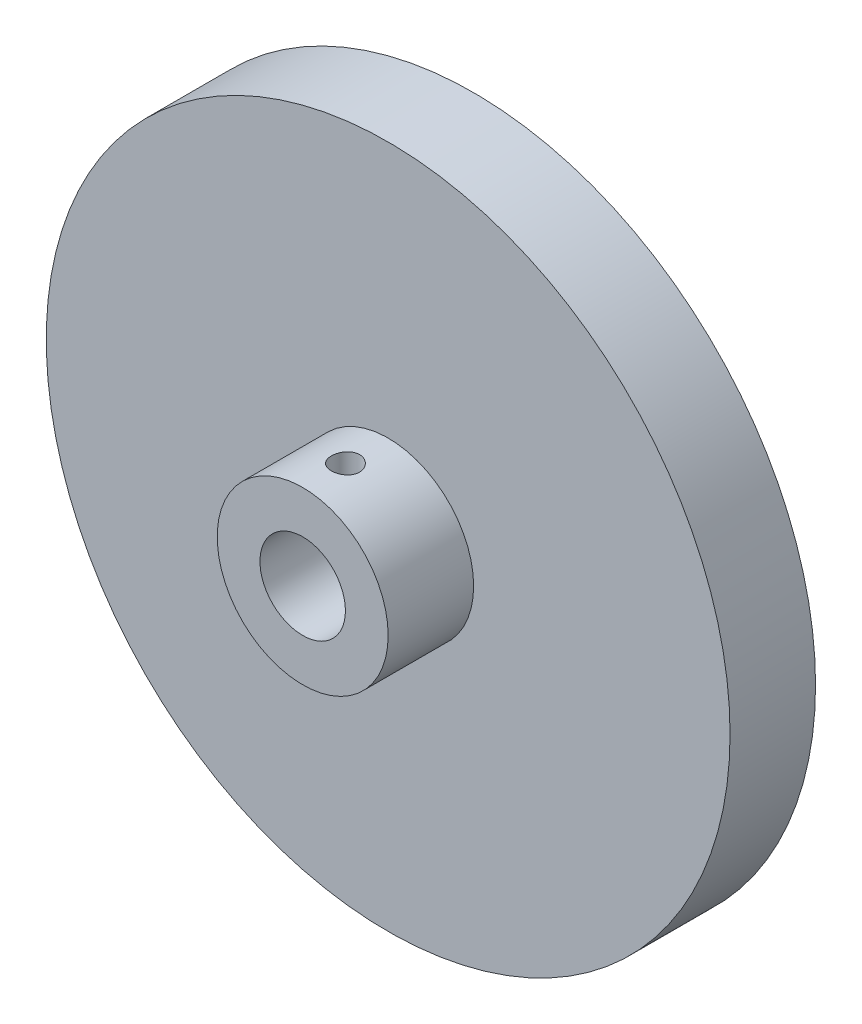
ISO-10303-21;
HEADER;
FILE_DESCRIPTION(('STEP AP214'),'2;1');
FILE_NAME('part.step','',(''),(''),'','','');
FILE_SCHEMA(('AUTOMOTIVE_DESIGN { 1 0 10303 214 1 1 1 1 }'));
ENDSEC;
DATA;
#1=APPLICATION_CONTEXT('core data for automotive mechanical design processes');
#2=APPLICATION_PROTOCOL_DEFINITION('international standard','automotive_design',2000,#1);
#3=PRODUCT_CONTEXT('',#1,'mechanical');
#4=PRODUCT('Part','Part','',(#3));
#5=PRODUCT_RELATED_PRODUCT_CATEGORY('part','',(#4));
#6=PRODUCT_DEFINITION_FORMATION('','',#4);
#7=PRODUCT_DEFINITION_CONTEXT('part definition',#1,'design');
#8=PRODUCT_DEFINITION('design','',#6,#7);
#9=PRODUCT_DEFINITION_SHAPE('','',#8);
#10=(LENGTH_UNIT() NAMED_UNIT(*) SI_UNIT(.MILLI.,.METRE.));
#11=(NAMED_UNIT(*) PLANE_ANGLE_UNIT() SI_UNIT($,.RADIAN.));
#12=(NAMED_UNIT(*) SI_UNIT($,.STERADIAN.) SOLID_ANGLE_UNIT());
#13=UNCERTAINTY_MEASURE_WITH_UNIT(LENGTH_MEASURE(1.E-05),#10,'distance_accuracy_value','');
#14=(GEOMETRIC_REPRESENTATION_CONTEXT(3) GLOBAL_UNCERTAINTY_ASSIGNED_CONTEXT((#13)) GLOBAL_UNIT_ASSIGNED_CONTEXT((#10,
#11,#12)) REPRESENTATION_CONTEXT('',''));
#15=CARTESIAN_POINT('',(0.,0.,0.));
#16=DIRECTION('',(0.,0.,1.));
#17=DIRECTION('',(1.,0.,0.));
#18=AXIS2_PLACEMENT_3D('',#15,#16,#17);
#19=CARTESIAN_POINT('',(0.,0.,20.));
#20=DIRECTION('',(0.,0.,-1.));
#21=DIRECTION('',(-1.,0.,0.));
#22=AXIS2_PLACEMENT_3D('',#19,#20,#21);
#23=CYLINDRICAL_SURFACE('',#22,10.);
#24=CARTESIAN_POINT('',(0.,0.,20.));
#25=DIRECTION('',(0.,0.,1.));
#26=DIRECTION('',(1.,0.,0.));
#27=AXIS2_PLACEMENT_3D('',#24,#25,#26);
#28=CIRCLE('',#27,10.);
#29=CARTESIAN_POINT('',(10.,0.,20.));
#30=VERTEX_POINT('',#29);
#31=EDGE_CURVE('E66',#30,#30,#28,.T.);
#32=ORIENTED_EDGE('',*,*,#31,.F.);
#33=EDGE_LOOP('',(#32));
#34=FACE_BOUND('',#33,.T.);
#35=CARTESIAN_POINT('',(0.,0.,10.));
#36=DIRECTION('',(0.,0.,1.));
#37=DIRECTION('',(1.,0.,0.));
#38=AXIS2_PLACEMENT_3D('',#35,#36,#37);
#39=CIRCLE('',#38,10.);
#40=CARTESIAN_POINT('',(10.,0.,10.));
#41=VERTEX_POINT('',#40);
#42=EDGE_CURVE('E10',#41,#41,#39,.T.);
#43=ORIENTED_EDGE('',*,*,#42,.T.);
#44=EDGE_LOOP('',(#43));
#45=FACE_BOUND('',#44,.T.);
#46=CARTESIAN_POINT('',(0.,10.,13.35));
#47=CARTESIAN_POINT('',(-0.0920114531057514,9.99999843258099,13.3500037009853));
#48=CARTESIAN_POINT('',(-0.184073454347173,9.99871684765511,13.3577224586854));
#49=CARTESIAN_POINT('',(-0.36561632253533,9.99372775496381,13.3883812351379));
#50=CARTESIAN_POINT('',(-0.455094721351769,9.99001800272159,13.4113353369588));
#51=CARTESIAN_POINT('',(-0.628817487751616,9.98058875631552,13.4717536389359));
#52=CARTESIAN_POINT('',(-0.713066038744487,9.974870893487,13.5092060635603));
#53=CARTESIAN_POINT('',(-0.874072236504043,9.96205444853338,13.5975272541486));
#54=CARTESIAN_POINT('',(-0.95083075765333,9.95495602786423,13.648394451505));
#55=CARTESIAN_POINT('',(-1.09540879372213,9.9400912001718,13.7626087771329));
#56=CARTESIAN_POINT('',(-1.16314787882339,9.93231968689365,13.8260570636183));
#57=CARTESIAN_POINT('',(-1.28706950777735,9.9170237472334,13.9634147735932));
#58=CARTESIAN_POINT('',(-1.34325132909589,9.90949933632427,14.0373248506432));
#59=CARTESIAN_POINT('',(-1.44278500045253,9.89550007731641,14.1940593436767));
#60=CARTESIAN_POINT('',(-1.48605749570899,9.88903182722124,14.2769347943439));
#61=CARTESIAN_POINT('',(-1.55803674048924,9.87794796970923,14.4489026252365));
#62=CARTESIAN_POINT('',(-1.58674445381556,9.87333223970889,14.5379945936493));
#63=CARTESIAN_POINT('',(-1.6285261950301,9.86652679242373,14.719014582001));
#64=CARTESIAN_POINT('',(-1.64173895927951,9.86431555933323,14.8109097556788));
#65=CARTESIAN_POINT('',(-1.65258585530687,9.86250435770823,14.9956373659234));
#66=CARTESIAN_POINT('',(-1.6502210677036,9.86290420804218,15.0884697370306));
#67=CARTESIAN_POINT('',(-1.63009303176278,9.86625034802632,15.2714472770567));
#68=CARTESIAN_POINT('',(-1.61248549472488,9.86917088684506,15.3616101140274));
#69=CARTESIAN_POINT('',(-1.5626160736781,9.87718903199043,15.5376840705334));
#70=CARTESIAN_POINT('',(-1.53035369619838,9.88228671162733,15.6235950467883));
#71=CARTESIAN_POINT('',(-1.45193210975571,9.89411264039674,15.7891935299244));
#72=CARTESIAN_POINT('',(-1.4057081060585,9.90084846298694,15.8688497892407));
#73=CARTESIAN_POINT('',(-1.30072141548377,9.9151864393107,16.0193343239078));
#74=CARTESIAN_POINT('',(-1.24195773629987,9.92278866158316,16.0901618999123));
#75=CARTESIAN_POINT('',(-1.11271072676603,9.93811607123993,16.2218799788827));
#76=CARTESIAN_POINT('',(-1.04209376928223,9.94584163094155,16.28263939463));
#77=CARTESIAN_POINT('',(-0.891597059898568,9.96045987838133,16.3914660216063));
#78=CARTESIAN_POINT('',(-0.811717250503359,9.9673525609492,16.4395331540471));
#79=CARTESIAN_POINT('',(-0.644840083170755,9.97953794169528,16.5216221505343));
#80=CARTESIAN_POINT('',(-0.557837003156561,9.98482933722619,16.555632587638));
#81=CARTESIAN_POINT('',(-0.379246930002472,9.99320544362233,16.6085219127753));
#82=CARTESIAN_POINT('',(-0.287660313260822,9.99629033536768,16.6274020411448));
#83=CARTESIAN_POINT('',(-0.103632983819162,9.99988156603306,16.6493174611612));
#84=CARTESIAN_POINT('',(-0.0112142564118359,10.0004171933872,16.6525327361215));
#85=CARTESIAN_POINT('',(0.172841505554681,9.99892971175882,16.6435068013197));
#86=CARTESIAN_POINT('',(0.264478569441164,9.99690669920295,16.6312661740395));
#87=CARTESIAN_POINT('',(0.443814955541769,9.99054737820398,16.5918255972229));
#88=CARTESIAN_POINT('',(0.531534371938301,9.98622483070291,16.5647146056916));
#89=CARTESIAN_POINT('',(0.701182959294593,9.97574921956607,16.4963976074449));
#90=CARTESIAN_POINT('',(0.78311181018899,9.96959605484327,16.4551908223383));
#91=CARTESIAN_POINT('',(0.939636398877253,9.95606928426946,16.359438680501));
#92=CARTESIAN_POINT('',(1.01416235726447,9.94868555427359,16.3047807140829));
#93=CARTESIAN_POINT('',(1.15304841333209,9.93354765732487,16.1838328509312));
#94=CARTESIAN_POINT('',(1.21740778758216,9.92579346406183,16.1175421271457));
#95=CARTESIAN_POINT('',(1.33479962911472,9.91069407401676,15.9744038936717));
#96=CARTESIAN_POINT('',(1.38771058951944,9.90335382329475,15.8974561289012));
#97=CARTESIAN_POINT('',(1.47985547415617,9.89000528724129,15.7356589529325));
#98=CARTESIAN_POINT('',(1.51908982562647,9.88399696030451,15.6508097886681));
#99=CARTESIAN_POINT('',(1.58258535747087,9.87402953570153,15.4759604675968));
#100=CARTESIAN_POINT('',(1.60690737863649,9.87006212213643,15.3859829002033));
#101=CARTESIAN_POINT('',(1.64007952798876,9.86460473721113,15.2031486882194));
#102=CARTESIAN_POINT('',(1.64893097191819,9.86311455516768,15.1102922891518));
#103=CARTESIAN_POINT('',(1.65087457438795,9.86278931217107,14.9255493586982));
#104=CARTESIAN_POINT('',(1.64415796786954,9.86392203182987,14.8336648398079));
#105=CARTESIAN_POINT('',(1.61556925478547,9.86864441177183,14.6523522481361));
#106=CARTESIAN_POINT('',(1.59369719454886,9.87223406454433,14.5629241678464));
#107=CARTESIAN_POINT('',(1.53549112071357,9.88145370519205,14.3891347575646));
#108=CARTESIAN_POINT('',(1.49917324977366,9.88708141498759,14.304767892549));
#109=CARTESIAN_POINT('',(1.41312606218935,9.89974533231771,14.1432937331397));
#110=CARTESIAN_POINT('',(1.36339610211421,9.90678160742252,14.0661867872723));
#111=CARTESIAN_POINT('',(1.25125259966706,9.92157214136343,13.9204545023623));
#112=CARTESIAN_POINT('',(1.18869826623127,9.92933379899765,13.8519382401804));
#113=CARTESIAN_POINT('',(1.05297867490409,9.94464125601211,13.7263094001232));
#114=CARTESIAN_POINT('',(0.979810970092673,9.95218700513286,13.6691994592198));
#115=CARTESIAN_POINT('',(0.824354696103048,9.96627143049842,13.5676525774265));
#116=CARTESIAN_POINT('',(0.742007852048188,9.97280295936929,13.523303852022));
#117=CARTESIAN_POINT('',(0.570959586923796,9.98405342047581,13.4491366471937));
#118=CARTESIAN_POINT('',(0.482264623543765,9.98877416450827,13.4193036358748));
#119=CARTESIAN_POINT('',(0.32768275824093,9.99483601455804,13.3815206584732));
#120=CARTESIAN_POINT('',(0.262733066711101,9.99676220083327,13.3697192511855));
#121=CARTESIAN_POINT('',(0.131864227625941,9.99934474465587,13.3539576610669));
#122=CARTESIAN_POINT('',(0.065945096254669,10.0000011233775,13.3499973474842));
#123=CARTESIAN_POINT('',(0.,10.,13.35));
#124=B_SPLINE_CURVE_WITH_KNOTS('',3,(#46,#47,#48,#49,#50,#51,#52,#53,#54,#55,#56,#57,#58,#59,
#60,#61,#62,#63,#64,#65,#66,#67,#68,#69,#70,#71,#72,#73,#74,#75,#76,#77,#78,#79,#80,#81,#82,#83,
#84,#85,#86,#87,#88,#89,#90,#91,#92,#93,#94,#95,#96,#97,#98,#99,#100,#101,#102,#103,#104,#105,
#106,#107,#108,#109,#110,#111,#112,#113,#114,#115,#116,#117,#118,#119,#120,#121,#122,#123),
.UNSPECIFIED.,.T.,.F.,(4,2,2,2,2,2,2,2,2,2,2,2,2,2,2,2,2,2,2,2,2,2,2,2,2,2,2,2,2,2,2,2,2,2,2,2,
2,2,4),(0.,0.275793319008919,0.551841928312974,0.827666799870601,1.10345943314171,
1.38156673144316,1.65969141110742,1.93949209608634,2.21927426326045,2.49653175525207,
2.7737700140227,3.04820914252878,3.32265751287873,3.59839967320043,3.87416366201708,
4.15327572401922,4.43238951858749,4.71172976565333,4.99104711092802,5.26714751096619,
5.54323750600191,5.81769359979006,6.09216485190805,6.36901711215388,6.6458890636926,
6.92556925596461,7.2052407106323,7.48376340648035,7.76226241335699,8.03735855216248,
8.31245385002405,8.58724259883662,8.86204453269319,9.1400425875962,9.41810483731135,
9.69804546871321,9.97770526783284,10.1753710978728,10.3730336317699),.UNSPECIFIED.);
#125=CARTESIAN_POINT('',(0.,10.,13.35));
#126=VERTEX_POINT('',#125);
#127=EDGE_CURVE('E81',#126,#126,#124,.T.);
#128=ORIENTED_EDGE('',*,*,#127,.F.);
#129=EDGE_LOOP('',(#128));
#130=FACE_BOUND('',#129,.T.);
#131=ADVANCED_FACE('F45',(#34,#45,#130),#23,.T.);
#132=CARTESIAN_POINT('',(0.,0.,20.));
#133=DIRECTION('',(0.,0.,-1.));
#134=DIRECTION('',(-1.,0.,0.));
#135=AXIS2_PLACEMENT_3D('',#132,#133,#134);
#136=CYLINDRICAL_SURFACE('',#135,5.);
#137=CARTESIAN_POINT('',(0.,0.,0.));
#138=DIRECTION('',(0.,0.,1.));
#139=DIRECTION('',(1.,0.,0.));
#140=AXIS2_PLACEMENT_3D('',#137,#138,#139);
#141=CIRCLE('',#140,5.);
#142=CARTESIAN_POINT('',(5.,0.,0.));
#143=VERTEX_POINT('',#142);
#144=EDGE_CURVE('E76',#143,#143,#141,.T.);
#145=ORIENTED_EDGE('',*,*,#144,.F.);
#146=EDGE_LOOP('',(#145));
#147=FACE_BOUND('',#146,.T.);
#148=CARTESIAN_POINT('',(0.,0.,20.));
#149=DIRECTION('',(0.,0.,1.));
#150=DIRECTION('',(1.,0.,0.));
#151=AXIS2_PLACEMENT_3D('',#148,#149,#150);
#152=CIRCLE('',#151,5.);
#153=CARTESIAN_POINT('',(5.,0.,20.));
#154=VERTEX_POINT('',#153);
#155=EDGE_CURVE('E72',#154,#154,#152,.T.);
#156=ORIENTED_EDGE('',*,*,#155,.T.);
#157=EDGE_LOOP('',(#156));
#158=FACE_BOUND('',#157,.T.);
#159=CARTESIAN_POINT('',(0.,5.,13.35));
#160=CARTESIAN_POINT('',(-0.0900803323989869,5.00000012564882,13.3499997574856));
#161=CARTESIAN_POINT('',(-0.180159574077354,4.99754312617873,13.3574008374849));
#162=CARTESIAN_POINT('',(-0.357667875169258,4.98798348171152,13.3867211495276));
#163=CARTESIAN_POINT('',(-0.445096605656321,4.98088026257134,13.4086421758353));
#164=CARTESIAN_POINT('',(-0.614719075952395,4.962800681432,13.4661713123883));
#165=CARTESIAN_POINT('',(-0.696921201899966,4.95183071876684,13.501756817014));
#166=CARTESIAN_POINT('',(-0.854190645874484,4.92713947248839,13.5855035726918));
#167=CARTESIAN_POINT('',(-0.929256597076055,4.91341766335966,13.6336672263034));
#168=CARTESIAN_POINT('',(-1.07267700256014,4.88414667976014,13.7429248230714));
#169=CARTESIAN_POINT('',(-1.140755021368,4.86855436886587,13.8043700182742));
#170=CARTESIAN_POINT('',(-1.26585047260417,4.83753907804007,13.9376995139198));
#171=CARTESIAN_POINT('',(-1.32286553369749,4.8221161350793,14.0095860466927));
#172=CARTESIAN_POINT('',(-1.42578155512387,4.79271313173333,14.1642306123794));
#173=CARTESIAN_POINT('',(-1.47132547146369,4.77878574898835,14.2472372375852));
#174=CARTESIAN_POINT('',(-1.54768950007051,4.75460549483772,14.4202656308341));
#175=CARTESIAN_POINT('',(-1.57851400356116,4.74435152777496,14.5102852973523));
#176=CARTESIAN_POINT('',(-1.62353134991424,4.72913282635101,14.6916448290813));
#177=CARTESIAN_POINT('',(-1.6382413417332,4.72400412235766,14.7828421633256));
#178=CARTESIAN_POINT('',(-1.65222861163856,4.7191313464795,14.966543612694));
#179=CARTESIAN_POINT('',(-1.65151054662635,4.71938564975367,15.0590473250677));
#180=CARTESIAN_POINT('',(-1.63506410098719,4.72510629107568,15.2383472023923));
#181=CARTESIAN_POINT('',(-1.62000769651633,4.73033928879681,15.3252137352388));
#182=CARTESIAN_POINT('',(-1.57640708934977,4.74504632523487,15.4951109061667));
#183=CARTESIAN_POINT('',(-1.54786130181506,4.75452086227438,15.5781410922653));
#184=CARTESIAN_POINT('',(-1.47764674240873,4.77681173941,15.7395474399946));
#185=CARTESIAN_POINT('',(-1.43577693123636,4.78967871947683,15.8178288502253));
#186=CARTESIAN_POINT('',(-1.34024242388315,4.81728315916032,15.9664683623015));
#187=CARTESIAN_POINT('',(-1.28657437554158,4.8320211498719,16.0368242036941));
#188=CARTESIAN_POINT('',(-1.16572801734404,4.86262798242566,16.1713952274102));
#189=CARTESIAN_POINT('',(-1.09799945388895,4.87851612594017,16.2351128786431));
#190=CARTESIAN_POINT('',(-0.952622363558088,4.9089733458653,16.3504141782392));
#191=CARTESIAN_POINT('',(-0.87497292381972,4.92354230068063,16.401996708755));
#192=CARTESIAN_POINT('',(-0.710918878360196,4.94990429259939,16.491953516837));
#193=CARTESIAN_POINT('',(-0.624437715003008,4.96166947936115,16.5301968972131));
#194=CARTESIAN_POINT('',(-0.445788820584337,4.98089634514734,16.5914397196063));
#195=CARTESIAN_POINT('',(-0.353623035566634,4.98835948795835,16.6144443470641));
#196=CARTESIAN_POINT('',(-0.170434936942809,4.99790001929539,16.6436807853833));
#197=CARTESIAN_POINT('',(-0.079531044940331,5.00019320840939,16.6505850936395));
#198=CARTESIAN_POINT('',(0.102152997074191,4.99978120399321,16.6493373673087));
#199=CARTESIAN_POINT('',(0.19293316503069,4.99707683523427,16.6411878171332));
#200=CARTESIAN_POINT('',(0.369117276094977,4.98711592890817,16.6105971738171));
#201=CARTESIAN_POINT('',(0.454600657078434,4.97999029806496,16.5885667899855));
#202=CARTESIAN_POINT('',(0.620625393385989,4.9620361021664,16.5313513084882));
#203=CARTESIAN_POINT('',(0.701166119538834,4.9512070668376,16.4961645401181));
#204=CARTESIAN_POINT('',(0.857353583850657,4.92659738190256,16.4126189804476));
#205=CARTESIAN_POINT('',(0.932818538636809,4.91274728599483,16.3639413852355));
#206=CARTESIAN_POINT('',(1.07472879779133,4.8836680633903,16.2551717652041));
#207=CARTESIAN_POINT('',(1.14117138619964,4.86843852373584,16.195076316326));
#208=CARTESIAN_POINT('',(1.26622547851877,4.83745909847491,16.0620138273081));
#209=CARTESIAN_POINT('',(1.32435715949936,4.82171620160002,15.9885931330763));
#210=CARTESIAN_POINT('',(1.42753142742358,4.79218567046632,15.8327001451063));
#211=CARTESIAN_POINT('',(1.47257396443646,4.77839804366632,15.7502278168408));
#212=CARTESIAN_POINT('',(1.54806908435208,4.75447746870333,15.5785745160417));
#213=CARTESIAN_POINT('',(1.57855621066785,4.74433588191365,15.4894100140228));
#214=CARTESIAN_POINT('',(1.62395003915296,4.728992662468,15.3068020979204));
#215=CARTESIAN_POINT('',(1.6388635764124,4.72378886275909,15.213360579788));
#216=CARTESIAN_POINT('',(1.65216049477084,4.71915352744857,15.0299145750871));
#217=CARTESIAN_POINT('',(1.65133872365081,4.71944442417866,14.9399740636218));
#218=CARTESIAN_POINT('',(1.63513842564514,4.72508139490563,14.7615834004098));
#219=CARTESIAN_POINT('',(1.61976073262756,4.73042717932209,14.6731331635849));
#220=CARTESIAN_POINT('',(1.57544291875232,4.74536693764461,14.5018358628154));
#221=CARTESIAN_POINT('',(1.5467552709297,4.75488165289364,14.4189160278425));
#222=CARTESIAN_POINT('',(1.47683540940046,4.77705935615133,14.2590025073374));
#223=CARTESIAN_POINT('',(1.43560044678477,4.78972303393433,14.1820101250481));
#224=CARTESIAN_POINT('',(1.33969084183066,4.81744939348764,14.0325565456336));
#225=CARTESIAN_POINT('',(1.28451538865982,4.83259170443489,13.9604315889302));
#226=CARTESIAN_POINT('',(1.16314331347536,4.86323043063064,13.826207419325));
#227=CARTESIAN_POINT('',(1.09694360376003,4.87872694403302,13.7641110248733));
#228=CARTESIAN_POINT('',(0.95238767673411,4.90903317548773,13.6493366681907));
#229=CARTESIAN_POINT('',(0.873665758138173,4.92379458911327,13.5971049783148));
#230=CARTESIAN_POINT('',(0.70807708205127,4.95031750248797,13.5066751421022));
#231=CARTESIAN_POINT('',(0.621212604024481,4.96207983840249,13.4684730828886));
#232=CARTESIAN_POINT('',(0.446386541872213,4.98076953032462,13.4089869849695));
#233=CARTESIAN_POINT('',(0.358709155083952,4.98791371763214,13.386936477516));
#234=CARTESIAN_POINT('',(0.180687007883427,4.99752827480817,13.3574450279568));
#235=CARTESIAN_POINT('',(0.0903429553968473,4.99999987398486,13.3500002432214));
#236=CARTESIAN_POINT('',(0.,5.,13.35));
#237=B_SPLINE_CURVE_WITH_KNOTS('',3,(#159,#160,#161,#162,#163,#164,#165,#166,#167,#168,#169,
#170,#171,#172,#173,#174,#175,#176,#177,#178,#179,#180,#181,#182,#183,#184,#185,#186,#187,#188,
#189,#190,#191,#192,#193,#194,#195,#196,#197,#198,#199,#200,#201,#202,#203,#204,#205,#206,#207,
#208,#209,#210,#211,#212,#213,#214,#215,#216,#217,#218,#219,#220,#221,#222,#223,#224,#225,#226,
#227,#228,#229,#230,#231,#232,#233,#234,#235,#236),.UNSPECIFIED.,.T.,.F.,(4,2,2,2,2,2,2,2,2,2,2,
2,2,2,2,2,2,2,2,2,2,2,2,2,2,2,2,2,2,2,2,2,2,2,2,2,2,2,4),(0.,0.2699086041325,0.539850567737248,
0.809347867689095,1.07889668217443,1.35671215765951,1.63458711701568,1.92026489148117,
2.20585738673402,2.48198869358467,2.75803665240173,3.02175295330504,3.28550024538373,
3.55343249441287,3.82144096800204,4.10314526837295,4.38487550826387,4.66929734218009,
4.95362234329175,5.22584041060147,5.49801355645393,5.76248915124948,6.02699834271655,
6.29838751507405,6.56985820217368,6.85340472718155,7.13695233381087,7.41982362841787,
7.70257072144072,7.9710746862461,8.23956327014096,8.50315503612411,8.76680459233092,
9.04176838412562,9.31680931840238,9.60227659952698,9.88766420298746,10.1584309528124,
10.4291264568694),.UNSPECIFIED.);
#238=CARTESIAN_POINT('',(0.,5.,13.35));
#239=VERTEX_POINT('',#238);
#240=EDGE_CURVE('E49',#239,#239,#237,.T.);
#241=ORIENTED_EDGE('',*,*,#240,.T.);
#242=EDGE_LOOP('',(#241));
#243=FACE_BOUND('',#242,.T.);
#244=ADVANCED_FACE('F96',(#147,#158,#243),#136,.F.);
#245=CARTESIAN_POINT('',(0.,0.,10.));
#246=DIRECTION('',(0.,0.,-1.));
#247=DIRECTION('',(-1.,0.,0.));
#248=AXIS2_PLACEMENT_3D('',#245,#246,#247);
#249=CYLINDRICAL_SURFACE('',#248,40.);
#250=CARTESIAN_POINT('',(0.,0.,10.));
#251=DIRECTION('',(0.,0.,1.));
#252=DIRECTION('',(1.,0.,0.));
#253=AXIS2_PLACEMENT_3D('',#250,#251,#252);
#254=CIRCLE('',#253,40.);
#255=CARTESIAN_POINT('',(40.,0.,10.));
#256=VERTEX_POINT('',#255);
#257=EDGE_CURVE('E58',#256,#256,#254,.T.);
#258=ORIENTED_EDGE('',*,*,#257,.F.);
#259=EDGE_LOOP('',(#258));
#260=FACE_BOUND('',#259,.T.);
#261=CARTESIAN_POINT('',(0.,0.,0.));
#262=DIRECTION('',(0.,0.,1.));
#263=DIRECTION('',(1.,0.,0.));
#264=AXIS2_PLACEMENT_3D('',#261,#262,#263);
#265=CIRCLE('',#264,40.);
#266=CARTESIAN_POINT('',(40.,0.,0.));
#267=VERTEX_POINT('',#266);
#268=EDGE_CURVE('E63',#267,#267,#265,.T.);
#269=ORIENTED_EDGE('',*,*,#268,.T.);
#270=EDGE_LOOP('',(#269));
#271=FACE_BOUND('',#270,.T.);
#272=ADVANCED_FACE('F47',(#260,#271),#249,.T.);
#273=CARTESIAN_POINT('',(0.,0.,10.));
#274=DIRECTION('',(0.,0.,1.));
#275=DIRECTION('',(1.,0.,0.));
#276=AXIS2_PLACEMENT_3D('',#273,#274,#275);
#277=PLANE('',#276);
#278=ORIENTED_EDGE('',*,*,#42,.F.);
#279=EDGE_LOOP('',(#278));
#280=FACE_BOUND('',#279,.T.);
#281=ORIENTED_EDGE('',*,*,#257,.T.);
#282=EDGE_LOOP('',(#281));
#283=FACE_BOUND('',#282,.T.);
#284=ADVANCED_FACE('F108',(#280,#283),#277,.T.);
#285=CARTESIAN_POINT('',(0.,0.,0.));
#286=DIRECTION('',(0.,0.,1.));
#287=DIRECTION('',(1.,0.,0.));
#288=AXIS2_PLACEMENT_3D('',#285,#286,#287);
#289=PLANE('',#288);
#290=ORIENTED_EDGE('',*,*,#144,.T.);
#291=EDGE_LOOP('',(#290));
#292=FACE_BOUND('',#291,.T.);
#293=ORIENTED_EDGE('',*,*,#268,.F.);
#294=EDGE_LOOP('',(#293));
#295=FACE_BOUND('',#294,.T.);
#296=ADVANCED_FACE('F102',(#292,#295),#289,.F.);
#297=CARTESIAN_POINT('',(0.,0.,20.));
#298=DIRECTION('',(0.,0.,1.));
#299=DIRECTION('',(1.,0.,0.));
#300=AXIS2_PLACEMENT_3D('',#297,#298,#299);
#301=PLANE('',#300);
#302=ORIENTED_EDGE('',*,*,#155,.F.);
#303=EDGE_LOOP('',(#302));
#304=FACE_BOUND('',#303,.T.);
#305=ORIENTED_EDGE('',*,*,#31,.T.);
#306=EDGE_LOOP('',(#305));
#307=FACE_BOUND('',#306,.T.);
#308=ADVANCED_FACE('F94',(#304,#307),#301,.T.);
#309=CARTESIAN_POINT('',(0.,10.,15.));
#310=DIRECTION('',(0.,-1.,0.));
#311=DIRECTION('',(0.,0.,-1.));
#312=AXIS2_PLACEMENT_3D('',#309,#310,#311);
#313=CYLINDRICAL_SURFACE('',#312,1.65);
#314=ORIENTED_EDGE('',*,*,#240,.F.);
#315=EDGE_LOOP('',(#314));
#316=FACE_BOUND('',#315,.T.);
#317=ORIENTED_EDGE('',*,*,#127,.T.);
#318=EDGE_LOOP('',(#317));
#319=FACE_BOUND('',#318,.T.);
#320=ADVANCED_FACE('F91',(#316,#319),#313,.F.);
#321=CLOSED_SHELL('',(#131,#244,#272,#284,#296,#308,#320));
#322=MANIFOLD_SOLID_BREP('B2',#321);
#323=ADVANCED_BREP_SHAPE_REPRESENTATION('',(#18,#322),#14);
#324=SHAPE_DEFINITION_REPRESENTATION(#9,#323);
ENDSEC;
END-ISO-10303-21;
